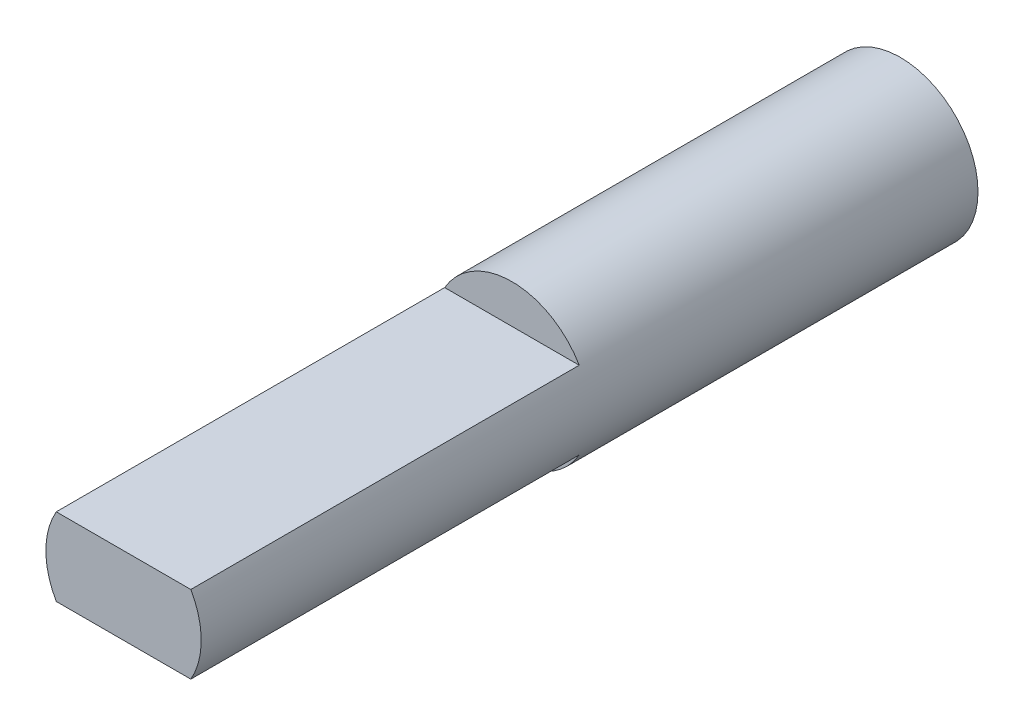
ISO-10303-21;
HEADER;
FILE_DESCRIPTION(('STEP AP214'),'2;1');
FILE_NAME('part.step','',(''),(''),'','','');
FILE_SCHEMA(('AUTOMOTIVE_DESIGN { 1 0 10303 214 1 1 1 1 }'));
ENDSEC;
DATA;
#1=APPLICATION_CONTEXT('core data for automotive mechanical design processes');
#2=APPLICATION_PROTOCOL_DEFINITION('international standard','automotive_design',2000,#1);
#3=PRODUCT_CONTEXT('',#1,'mechanical');
#4=PRODUCT('Part','Part','',(#3));
#5=PRODUCT_RELATED_PRODUCT_CATEGORY('part','',(#4));
#6=PRODUCT_DEFINITION_FORMATION('','',#4);
#7=PRODUCT_DEFINITION_CONTEXT('part definition',#1,'design');
#8=PRODUCT_DEFINITION('design','',#6,#7);
#9=PRODUCT_DEFINITION_SHAPE('','',#8);
#10=(LENGTH_UNIT() NAMED_UNIT(*) SI_UNIT(.MILLI.,.METRE.));
#11=(NAMED_UNIT(*) PLANE_ANGLE_UNIT() SI_UNIT($,.RADIAN.));
#12=(NAMED_UNIT(*) SI_UNIT($,.STERADIAN.) SOLID_ANGLE_UNIT());
#13=UNCERTAINTY_MEASURE_WITH_UNIT(LENGTH_MEASURE(1.E-05),#10,'distance_accuracy_value','');
#14=(GEOMETRIC_REPRESENTATION_CONTEXT(3) GLOBAL_UNCERTAINTY_ASSIGNED_CONTEXT((#13)) GLOBAL_UNIT_ASSIGNED_CONTEXT((#10,
#11,#12)) REPRESENTATION_CONTEXT('',''));
#15=CARTESIAN_POINT('',(0.,0.,0.));
#16=DIRECTION('',(0.,0.,1.));
#17=DIRECTION('',(1.,0.,0.));
#18=AXIS2_PLACEMENT_3D('',#15,#16,#17);
#19=CARTESIAN_POINT('',(-12.6378569128055,12.3010053138,5.));
#20=DIRECTION('',(0.,0.,1.));
#21=DIRECTION('',(1.,0.,0.));
#22=AXIS2_PLACEMENT_3D('',#19,#20,#21);
#23=PLANE('',#22);
#24=DIRECTION('',(-1.,0.,0.));
#25=VECTOR('',#24,1.);
#26=CARTESIAN_POINT('',(-13.50388231659,12.8010053138,5.));
#27=LINE('',#26,#25);
#28=CARTESIAN_POINT('',(-11.7718315090211,12.8010053138,5.));
#29=VERTEX_POINT('',#28);
#30=CARTESIAN_POINT('',(-13.50388231659,12.8010053138,5.));
#31=VERTEX_POINT('',#30);
#32=EDGE_CURVE('E101',#29,#31,#27,.T.);
#33=ORIENTED_EDGE('',*,*,#32,.F.);
#34=CARTESIAN_POINT('',(-12.6378569128055,12.3010053138,5.));
#35=DIRECTION('',(0.,0.,1.));
#36=DIRECTION('',(1.,0.,0.));
#37=AXIS2_PLACEMENT_3D('',#34,#35,#36);
#38=CIRCLE('',#37,1.);
#39=EDGE_CURVE('E11',#29,#31,#38,.T.);
#40=ORIENTED_EDGE('',*,*,#39,.T.);
#41=EDGE_LOOP('',(#33,#40));
#42=FACE_BOUND('',#41,.T.);
#43=ADVANCED_FACE('F39',(#42),#23,.T.);
#44=CARTESIAN_POINT('',(-12.6378569128055,12.3010053138,5.));
#45=DIRECTION('',(0.,0.,-1.));
#46=DIRECTION('',(-1.,0.,0.));
#47=AXIS2_PLACEMENT_3D('',#44,#45,#46);
#48=CYLINDRICAL_SURFACE('',#47,1.);
#49=ORIENTED_EDGE('',*,*,#39,.F.);
#50=DIRECTION('',(0.,0.,-1.));
#51=VECTOR('',#50,1.);
#52=CARTESIAN_POINT('',(-11.7718315090211,12.8010053138,10.));
#53=LINE('',#52,#51);
#54=CARTESIAN_POINT('',(-11.7718315090211,12.8010053138,10.));
#55=VERTEX_POINT('',#54);
#56=EDGE_CURVE('E109',#55,#29,#53,.T.);
#57=ORIENTED_EDGE('',*,*,#56,.F.);
#58=CARTESIAN_POINT('',(-12.6378569128056,12.3010053138,10.));
#59=DIRECTION('',(0.,0.,1.));
#60=DIRECTION('',(-1.,0.,0.));
#61=AXIS2_PLACEMENT_3D('',#58,#59,#60);
#62=CIRCLE('',#61,1.00000000000002);
#63=CARTESIAN_POINT('',(-11.7718315090211,11.8010053138,10.));
#64=VERTEX_POINT('',#63);
#65=EDGE_CURVE('E90',#64,#55,#62,.T.);
#66=ORIENTED_EDGE('',*,*,#65,.F.);
#67=DIRECTION('',(0.,0.,-1.));
#68=VECTOR('',#67,1.);
#69=CARTESIAN_POINT('',(-11.7718315090211,11.8010053138,10.));
#70=LINE('',#69,#68);
#71=CARTESIAN_POINT('',(-11.7718315090211,11.8010053138,5.));
#72=VERTEX_POINT('',#71);
#73=EDGE_CURVE('E86',#64,#72,#70,.T.);
#74=ORIENTED_EDGE('',*,*,#73,.T.);
#75=CARTESIAN_POINT('',(-13.50388231659,11.8010053138,5.));
#76=VERTEX_POINT('',#75);
#77=EDGE_CURVE('E49',#76,#72,#38,.T.);
#78=ORIENTED_EDGE('',*,*,#77,.F.);
#79=DIRECTION('',(0.,0.,-1.));
#80=VECTOR('',#79,1.);
#81=CARTESIAN_POINT('',(-13.50388231659,11.8010053138,10.));
#82=LINE('',#81,#80);
#83=CARTESIAN_POINT('',(-13.50388231659,11.8010053138,10.));
#84=VERTEX_POINT('',#83);
#85=EDGE_CURVE('E84',#84,#76,#82,.T.);
#86=ORIENTED_EDGE('',*,*,#85,.F.);
#87=CARTESIAN_POINT('',(-12.6378569128055,12.3010053138,10.));
#88=DIRECTION('',(0.,0.,1.));
#89=DIRECTION('',(1.,0.,0.));
#90=AXIS2_PLACEMENT_3D('',#87,#88,#89);
#91=CIRCLE('',#90,1.00000000000001);
#92=CARTESIAN_POINT('',(-13.50388231659,12.8010053138,10.));
#93=VERTEX_POINT('',#92);
#94=EDGE_CURVE('E91',#93,#84,#91,.T.);
#95=ORIENTED_EDGE('',*,*,#94,.F.);
#96=DIRECTION('',(0.,0.,-1.));
#97=VECTOR('',#96,1.);
#98=CARTESIAN_POINT('',(-13.50388231659,12.8010053138,10.));
#99=LINE('',#98,#97);
#100=EDGE_CURVE('E115',#93,#31,#99,.T.);
#101=ORIENTED_EDGE('',*,*,#100,.T.);
#102=EDGE_LOOP('',(#49,#57,#66,#74,#78,#86,#95,#101));
#103=FACE_BOUND('',#102,.T.);
#104=CARTESIAN_POINT('',(-12.6378569128055,12.3010053138,0.));
#105=DIRECTION('',(0.,0.,1.));
#106=DIRECTION('',(1.,0.,0.));
#107=AXIS2_PLACEMENT_3D('',#104,#105,#106);
#108=CIRCLE('',#107,1.);
#109=CARTESIAN_POINT('',(-11.6378569128055,12.3010053138,0.));
#110=VERTEX_POINT('',#109);
#111=EDGE_CURVE('E43',#110,#110,#108,.T.);
#112=ORIENTED_EDGE('',*,*,#111,.T.);
#113=EDGE_LOOP('',(#112));
#114=FACE_BOUND('',#113,.T.);
#115=ADVANCED_FACE('F41',(#103,#114),#48,.T.);
#116=DIRECTION('',(1.,0.,0.));
#117=VECTOR('',#116,1.);
#118=CARTESIAN_POINT('',(-13.50388231659,11.8010053138,5.));
#119=LINE('',#118,#117);
#120=EDGE_CURVE('E55',#76,#72,#119,.T.);
#121=ORIENTED_EDGE('',*,*,#120,.F.);
#122=ORIENTED_EDGE('',*,*,#77,.T.);
#123=EDGE_LOOP('',(#121,#122));
#124=FACE_BOUND('',#123,.T.);
#125=ADVANCED_FACE('F130',(#124),#23,.T.);
#126=CARTESIAN_POINT('',(-12.6378569128055,12.3010053138,0.));
#127=DIRECTION('',(0.,0.,1.));
#128=DIRECTION('',(1.,0.,0.));
#129=AXIS2_PLACEMENT_3D('',#126,#127,#128);
#130=PLANE('',#129);
#131=ORIENTED_EDGE('',*,*,#111,.F.);
#132=EDGE_LOOP('',(#131));
#133=FACE_BOUND('',#132,.T.);
#134=ADVANCED_FACE('F136',(#133),#130,.F.);
#135=CARTESIAN_POINT('',(-13.50388231659,11.8010053138,10.));
#136=DIRECTION('',(0.,1.,0.));
#137=DIRECTION('',(0.,0.,1.));
#138=AXIS2_PLACEMENT_3D('',#135,#136,#137);
#139=PLANE('',#138);
#140=ORIENTED_EDGE('',*,*,#120,.T.);
#141=ORIENTED_EDGE('',*,*,#73,.F.);
#142=DIRECTION('',(1.,0.,0.));
#143=VECTOR('',#142,1.);
#144=CARTESIAN_POINT('',(-13.50388231659,11.8010053138,10.));
#145=LINE('',#144,#143);
#146=EDGE_CURVE('E80',#84,#64,#145,.T.);
#147=ORIENTED_EDGE('',*,*,#146,.F.);
#148=ORIENTED_EDGE('',*,*,#85,.T.);
#149=EDGE_LOOP('',(#140,#141,#147,#148));
#150=FACE_BOUND('',#149,.T.);
#151=ADVANCED_FACE('F82',(#150),#139,.F.);
#152=CARTESIAN_POINT('',(-13.50388231659,12.8010053138,10.));
#153=DIRECTION('',(0.,-1.,0.));
#154=DIRECTION('',(0.,0.,-1.));
#155=AXIS2_PLACEMENT_3D('',#152,#153,#154);
#156=PLANE('',#155);
#157=ORIENTED_EDGE('',*,*,#32,.T.);
#158=ORIENTED_EDGE('',*,*,#100,.F.);
#159=DIRECTION('',(-1.,0.,0.));
#160=VECTOR('',#159,1.);
#161=CARTESIAN_POINT('',(-13.50388231659,12.8010053138,10.));
#162=LINE('',#161,#160);
#163=EDGE_CURVE('E96',#55,#93,#162,.T.);
#164=ORIENTED_EDGE('',*,*,#163,.F.);
#165=ORIENTED_EDGE('',*,*,#56,.T.);
#166=EDGE_LOOP('',(#157,#158,#164,#165));
#167=FACE_BOUND('',#166,.T.);
#168=ADVANCED_FACE('F127',(#167),#156,.F.);
#169=CARTESIAN_POINT('',(-12.6378569128055,12.3010053138,10.));
#170=DIRECTION('',(0.,0.,1.));
#171=DIRECTION('',(1.,0.,0.));
#172=AXIS2_PLACEMENT_3D('',#169,#170,#171);
#173=PLANE('',#172);
#174=ORIENTED_EDGE('',*,*,#94,.T.);
#175=ORIENTED_EDGE('',*,*,#146,.T.);
#176=ORIENTED_EDGE('',*,*,#65,.T.);
#177=ORIENTED_EDGE('',*,*,#163,.T.);
#178=EDGE_LOOP('',(#174,#175,#176,#177));
#179=FACE_BOUND('',#178,.T.);
#180=ADVANCED_FACE('F94',(#179),#173,.T.);
#181=CLOSED_SHELL('',(#43,#115,#125,#134,#151,#168,#180));
#182=MANIFOLD_SOLID_BREP('B2',#181);
#183=ADVANCED_BREP_SHAPE_REPRESENTATION('',(#18,#182),#14);
#184=SHAPE_DEFINITION_REPRESENTATION(#9,#183);
ENDSEC;
END-ISO-10303-21;
